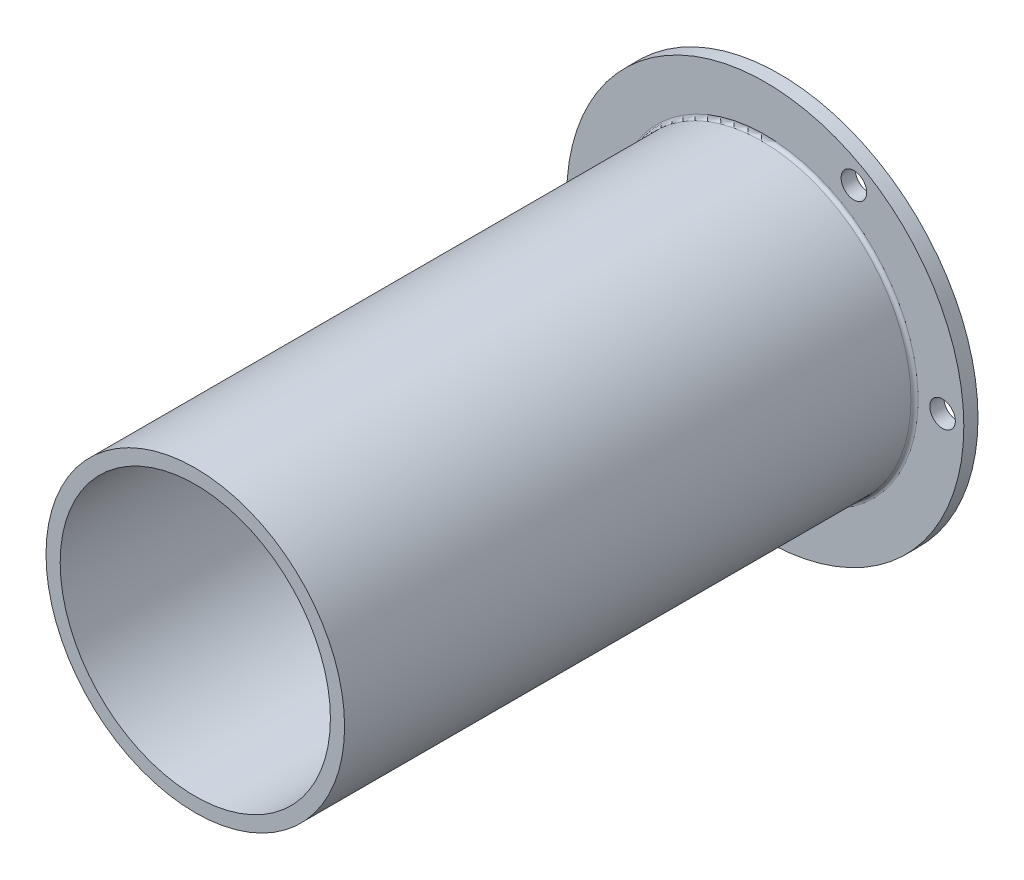
ISO-10303-21;
HEADER;
FILE_DESCRIPTION(('STEP AP214'),'2;1');
FILE_NAME('part.step','',(''),(''),'','','');
FILE_SCHEMA(('AUTOMOTIVE_DESIGN { 1 0 10303 214 1 1 1 1 }'));
ENDSEC;
DATA;
#1=APPLICATION_CONTEXT('core data for automotive mechanical design processes');
#2=APPLICATION_PROTOCOL_DEFINITION('international standard','automotive_design',2000,#1);
#3=PRODUCT_CONTEXT('',#1,'mechanical');
#4=PRODUCT('Part','Part','',(#3));
#5=PRODUCT_RELATED_PRODUCT_CATEGORY('part','',(#4));
#6=PRODUCT_DEFINITION_FORMATION('','',#4);
#7=PRODUCT_DEFINITION_CONTEXT('part definition',#1,'design');
#8=PRODUCT_DEFINITION('design','',#6,#7);
#9=PRODUCT_DEFINITION_SHAPE('','',#8);
#10=(LENGTH_UNIT() NAMED_UNIT(*) SI_UNIT(.MILLI.,.METRE.));
#11=(NAMED_UNIT(*) PLANE_ANGLE_UNIT() SI_UNIT($,.RADIAN.));
#12=(NAMED_UNIT(*) SI_UNIT($,.STERADIAN.) SOLID_ANGLE_UNIT());
#13=UNCERTAINTY_MEASURE_WITH_UNIT(LENGTH_MEASURE(1.E-05),#10,'distance_accuracy_value','');
#14=(GEOMETRIC_REPRESENTATION_CONTEXT(3) GLOBAL_UNCERTAINTY_ASSIGNED_CONTEXT((#13)) GLOBAL_UNIT_ASSIGNED_CONTEXT((#10,
#11,#12)) REPRESENTATION_CONTEXT('',''));
#15=CARTESIAN_POINT('',(0.,0.,0.));
#16=DIRECTION('',(0.,0.,1.));
#17=DIRECTION('',(1.,0.,0.));
#18=AXIS2_PLACEMENT_3D('',#15,#16,#17);
#19=CARTESIAN_POINT('',(0.,0.,40.18));
#20=DIRECTION('',(0.,0.,1.));
#21=DIRECTION('',(1.,0.,0.));
#22=AXIS2_PLACEMENT_3D('',#19,#20,#21);
#23=PLANE('',#22);
#24=CARTESIAN_POINT('',(0.,0.,40.18));
#25=DIRECTION('',(0.,0.,1.));
#26=DIRECTION('',(1.,0.,0.));
#27=AXIS2_PLACEMENT_3D('',#24,#25,#26);
#28=CIRCLE('',#27,10.525);
#29=CARTESIAN_POINT('',(10.525,0.,40.18));
#30=VERTEX_POINT('',#29);
#31=EDGE_CURVE('E42',#30,#30,#28,.T.);
#32=ORIENTED_EDGE('',*,*,#31,.T.);
#33=EDGE_LOOP('',(#32));
#34=FACE_BOUND('',#33,.T.);
#35=CARTESIAN_POINT('',(0.,0.,40.18));
#36=DIRECTION('',(0.,0.,1.));
#37=DIRECTION('',(1.,0.,0.));
#38=AXIS2_PLACEMENT_3D('',#35,#36,#37);
#39=CIRCLE('',#38,9.525);
#40=CARTESIAN_POINT('',(9.525,0.,40.18));
#41=VERTEX_POINT('',#40);
#42=EDGE_CURVE('E46',#41,#41,#39,.T.);
#43=ORIENTED_EDGE('',*,*,#42,.F.);
#44=EDGE_LOOP('',(#43));
#45=FACE_BOUND('',#44,.T.);
#46=ADVANCED_FACE('F31',(#34,#45),#23,.T.);
#47=CARTESIAN_POINT('',(0.,0.,40.18));
#48=DIRECTION('',(0.,0.,-1.));
#49=DIRECTION('',(-1.,0.,0.));
#50=AXIS2_PLACEMENT_3D('',#47,#48,#49);
#51=CYLINDRICAL_SURFACE('',#50,10.525);
#52=CARTESIAN_POINT('',(0.,0.,0.25));
#53=DIRECTION('',(0.,0.,-1.));
#54=DIRECTION('',(-1.,0.,0.));
#55=AXIS2_PLACEMENT_3D('',#52,#53,#54);
#56=CIRCLE('',#55,10.525);
#57=CARTESIAN_POINT('',(-10.525,0.,0.25));
#58=VERTEX_POINT('',#57);
#59=EDGE_CURVE('E38',#58,#58,#56,.F.);
#60=ORIENTED_EDGE('',*,*,#59,.T.);
#61=EDGE_LOOP('',(#60));
#62=FACE_BOUND('',#61,.T.);
#63=ORIENTED_EDGE('',*,*,#31,.F.);
#64=EDGE_LOOP('',(#63));
#65=FACE_BOUND('',#64,.T.);
#66=ADVANCED_FACE('F105',(#62,#65),#51,.T.);
#67=CARTESIAN_POINT('',(0.,0.,40.18));
#68=DIRECTION('',(0.,0.,-1.));
#69=DIRECTION('',(-1.,0.,0.));
#70=AXIS2_PLACEMENT_3D('',#67,#68,#69);
#71=CYLINDRICAL_SURFACE('',#70,9.525);
#72=ORIENTED_EDGE('',*,*,#42,.T.);
#73=EDGE_LOOP('',(#72));
#74=FACE_BOUND('',#73,.T.);
#75=CARTESIAN_POINT('',(0.,0.,-1.));
#76=DIRECTION('',(0.,0.,-1.));
#77=DIRECTION('',(-1.,0.,0.));
#78=AXIS2_PLACEMENT_3D('',#75,#76,#77);
#79=CIRCLE('',#78,9.525);
#80=CARTESIAN_POINT('',(-9.525,0.,-1.));
#81=VERTEX_POINT('',#80);
#82=EDGE_CURVE('E55',#81,#81,#79,.T.);
#83=ORIENTED_EDGE('',*,*,#82,.T.);
#84=EDGE_LOOP('',(#83));
#85=FACE_BOUND('',#84,.T.);
#86=ADVANCED_FACE('F92',(#74,#85),#71,.F.);
#87=CARTESIAN_POINT('',(0.,0.,-1.));
#88=DIRECTION('',(0.,0.,-1.));
#89=DIRECTION('',(-1.,0.,0.));
#90=AXIS2_PLACEMENT_3D('',#87,#88,#89);
#91=PLANE('',#90);
#92=CARTESIAN_POINT('',(6.25000000000005,10.8253175473055,-1.));
#93=DIRECTION('',(0.,0.,-1.));
#94=DIRECTION('',(0.500000000000004,0.866025403784436,0.));
#95=AXIS2_PLACEMENT_3D('',#92,#93,#94);
#96=CIRCLE('',#95,0.899999999999999);
#97=CARTESIAN_POINT('',(6.70000000000006,11.6047404107115,-1.));
#98=VERTEX_POINT('',#97);
#99=EDGE_CURVE('E77',#98,#98,#96,.T.);
#100=ORIENTED_EDGE('',*,*,#99,.F.);
#101=EDGE_LOOP('',(#100));
#102=FACE_BOUND('',#101,.T.);
#103=CARTESIAN_POINT('',(12.5,0.,-1.));
#104=DIRECTION('',(0.,0.,-1.));
#105=DIRECTION('',(1.,0.,0.));
#106=AXIS2_PLACEMENT_3D('',#103,#104,#105);
#107=CIRCLE('',#106,0.899999999999999);
#108=CARTESIAN_POINT('',(13.4,0.,-1.));
#109=VERTEX_POINT('',#108);
#110=EDGE_CURVE('E70',#109,#109,#107,.T.);
#111=ORIENTED_EDGE('',*,*,#110,.F.);
#112=EDGE_LOOP('',(#111));
#113=FACE_BOUND('',#112,.T.);
#114=CARTESIAN_POINT('',(-6.25000000000013,-10.8253175473054,-1.));
#115=DIRECTION('',(0.,0.,-1.));
#116=DIRECTION('',(-0.50000000000001,-0.866025403784433,0.));
#117=AXIS2_PLACEMENT_3D('',#114,#115,#116);
#118=CIRCLE('',#117,0.899999999999999);
#119=CARTESIAN_POINT('',(-6.70000000000014,-11.6047404107114,-1.));
#120=VERTEX_POINT('',#119);
#121=EDGE_CURVE('E71',#120,#120,#118,.T.);
#122=ORIENTED_EDGE('',*,*,#121,.F.);
#123=EDGE_LOOP('',(#122));
#124=FACE_BOUND('',#123,.T.);
#125=CARTESIAN_POINT('',(-12.5,0.,-1.));
#126=DIRECTION('',(0.,0.,-1.));
#127=DIRECTION('',(-1.,0.,0.));
#128=AXIS2_PLACEMENT_3D('',#125,#126,#127);
#129=CIRCLE('',#128,0.899999999999999);
#130=CARTESIAN_POINT('',(-13.4,0.,-1.));
#131=VERTEX_POINT('',#130);
#132=EDGE_CURVE('E60',#131,#131,#129,.T.);
#133=ORIENTED_EDGE('',*,*,#132,.F.);
#134=EDGE_LOOP('',(#133));
#135=FACE_BOUND('',#134,.T.);
#136=CARTESIAN_POINT('',(0.,0.,-1.));
#137=DIRECTION('',(0.,0.,-1.));
#138=DIRECTION('',(-1.,0.,0.));
#139=AXIS2_PLACEMENT_3D('',#136,#137,#138);
#140=CIRCLE('',#139,14.);
#141=CARTESIAN_POINT('',(-14.,0.,-1.));
#142=VERTEX_POINT('',#141);
#143=EDGE_CURVE('E51',#142,#142,#140,.T.);
#144=ORIENTED_EDGE('',*,*,#143,.T.);
#145=EDGE_LOOP('',(#144));
#146=FACE_BOUND('',#145,.T.);
#147=ORIENTED_EDGE('',*,*,#82,.F.);
#148=EDGE_LOOP('',(#147));
#149=FACE_BOUND('',#148,.T.);
#150=ADVANCED_FACE('F88',(#102,#113,#124,#135,#146,#149),#91,.T.);
#151=CARTESIAN_POINT('',(0.,0.,0.));
#152=DIRECTION('',(0.,0.,-1.));
#153=DIRECTION('',(-1.,0.,0.));
#154=AXIS2_PLACEMENT_3D('',#151,#152,#153);
#155=PLANE('',#154);
#156=CARTESIAN_POINT('',(0.,0.,0.));
#157=DIRECTION('',(0.,0.,-1.));
#158=DIRECTION('',(-1.,0.,0.));
#159=AXIS2_PLACEMENT_3D('',#156,#157,#158);
#160=CIRCLE('',#159,10.775);
#161=CARTESIAN_POINT('',(-10.775,0.,0.));
#162=VERTEX_POINT('',#161);
#163=EDGE_CURVE('E10',#162,#162,#160,.T.);
#164=ORIENTED_EDGE('',*,*,#163,.T.);
#165=EDGE_LOOP('',(#164));
#166=FACE_BOUND('',#165,.T.);
#167=CARTESIAN_POINT('',(6.25000000000005,10.8253175473055,0.));
#168=DIRECTION('',(0.,0.,1.));
#169=DIRECTION('',(-0.500000000000004,-0.866025403784436,0.));
#170=AXIS2_PLACEMENT_3D('',#167,#168,#169);
#171=CIRCLE('',#170,0.9);
#172=CARTESIAN_POINT('',(5.80000000000005,10.0458946838995,0.));
#173=VERTEX_POINT('',#172);
#174=EDGE_CURVE('E66',#173,#173,#171,.T.);
#175=ORIENTED_EDGE('',*,*,#174,.F.);
#176=EDGE_LOOP('',(#175));
#177=FACE_BOUND('',#176,.T.);
#178=CARTESIAN_POINT('',(12.5,0.,0.));
#179=DIRECTION('',(0.,0.,1.));
#180=DIRECTION('',(-1.,0.,0.));
#181=AXIS2_PLACEMENT_3D('',#178,#179,#180);
#182=CIRCLE('',#181,0.9);
#183=CARTESIAN_POINT('',(11.6,0.,0.));
#184=VERTEX_POINT('',#183);
#185=EDGE_CURVE('E74',#184,#184,#182,.T.);
#186=ORIENTED_EDGE('',*,*,#185,.F.);
#187=EDGE_LOOP('',(#186));
#188=FACE_BOUND('',#187,.T.);
#189=CARTESIAN_POINT('',(-6.25000000000013,-10.8253175473054,0.));
#190=DIRECTION('',(0.,0.,1.));
#191=DIRECTION('',(0.50000000000001,0.866025403784433,0.));
#192=AXIS2_PLACEMENT_3D('',#189,#190,#191);
#193=CIRCLE('',#192,0.9);
#194=CARTESIAN_POINT('',(-5.80000000000012,-10.0458946838994,0.));
#195=VERTEX_POINT('',#194);
#196=EDGE_CURVE('E67',#195,#195,#193,.T.);
#197=ORIENTED_EDGE('',*,*,#196,.F.);
#198=EDGE_LOOP('',(#197));
#199=FACE_BOUND('',#198,.T.);
#200=CARTESIAN_POINT('',(-12.5,0.,0.));
#201=DIRECTION('',(0.,0.,1.));
#202=DIRECTION('',(1.,0.,0.));
#203=AXIS2_PLACEMENT_3D('',#200,#201,#202);
#204=CIRCLE('',#203,0.9);
#205=CARTESIAN_POINT('',(-11.6,0.,0.));
#206=VERTEX_POINT('',#205);
#207=EDGE_CURVE('E63',#206,#206,#204,.T.);
#208=ORIENTED_EDGE('',*,*,#207,.F.);
#209=EDGE_LOOP('',(#208));
#210=FACE_BOUND('',#209,.T.);
#211=CARTESIAN_POINT('',(0.,0.,0.));
#212=DIRECTION('',(0.,0.,-1.));
#213=DIRECTION('',(-1.,0.,0.));
#214=AXIS2_PLACEMENT_3D('',#211,#212,#213);
#215=CIRCLE('',#214,14.);
#216=CARTESIAN_POINT('',(-14.,0.,0.));
#217=VERTEX_POINT('',#216);
#218=EDGE_CURVE('E52',#217,#217,#215,.T.);
#219=ORIENTED_EDGE('',*,*,#218,.F.);
#220=EDGE_LOOP('',(#219));
#221=FACE_BOUND('',#220,.T.);
#222=ADVANCED_FACE('F91',(#166,#177,#188,#199,#210,#221),#155,.F.);
#223=CARTESIAN_POINT('',(0.,0.,-1.));
#224=DIRECTION('',(0.,0.,1.));
#225=DIRECTION('',(1.,0.,0.));
#226=AXIS2_PLACEMENT_3D('',#223,#224,#225);
#227=CYLINDRICAL_SURFACE('',#226,14.);
#228=ORIENTED_EDGE('',*,*,#143,.F.);
#229=EDGE_LOOP('',(#228));
#230=FACE_BOUND('',#229,.T.);
#231=ORIENTED_EDGE('',*,*,#218,.T.);
#232=EDGE_LOOP('',(#231));
#233=FACE_BOUND('',#232,.T.);
#234=ADVANCED_FACE('F140',(#230,#233),#227,.T.);
#235=CARTESIAN_POINT('',(-12.5,0.,0.));
#236=DIRECTION('',(0.,0.,1.));
#237=DIRECTION('',(1.,0.,0.));
#238=AXIS2_PLACEMENT_3D('',#235,#236,#237);
#239=CYLINDRICAL_SURFACE('',#238,0.899999999999999);
#240=ORIENTED_EDGE('',*,*,#132,.T.);
#241=EDGE_LOOP('',(#240));
#242=FACE_BOUND('',#241,.T.);
#243=ORIENTED_EDGE('',*,*,#207,.T.);
#244=EDGE_LOOP('',(#243));
#245=FACE_BOUND('',#244,.T.);
#246=ADVANCED_FACE('F169',(#242,#245),#239,.F.);
#247=CARTESIAN_POINT('',(-6.25000000000013,-10.8253175473054,0.));
#248=DIRECTION('',(0.,0.,1.));
#249=DIRECTION('',(0.50000000000001,0.866025403784433,0.));
#250=AXIS2_PLACEMENT_3D('',#247,#248,#249);
#251=CYLINDRICAL_SURFACE('',#250,0.899999999999999);
#252=ORIENTED_EDGE('',*,*,#121,.T.);
#253=EDGE_LOOP('',(#252));
#254=FACE_BOUND('',#253,.T.);
#255=ORIENTED_EDGE('',*,*,#196,.T.);
#256=EDGE_LOOP('',(#255));
#257=FACE_BOUND('',#256,.T.);
#258=ADVANCED_FACE('F161',(#254,#257),#251,.F.);
#259=CARTESIAN_POINT('',(12.5,0.,0.));
#260=DIRECTION('',(0.,0.,1.));
#261=DIRECTION('',(-1.,0.,0.));
#262=AXIS2_PLACEMENT_3D('',#259,#260,#261);
#263=CYLINDRICAL_SURFACE('',#262,0.899999999999999);
#264=ORIENTED_EDGE('',*,*,#110,.T.);
#265=EDGE_LOOP('',(#264));
#266=FACE_BOUND('',#265,.T.);
#267=ORIENTED_EDGE('',*,*,#185,.T.);
#268=EDGE_LOOP('',(#267));
#269=FACE_BOUND('',#268,.T.);
#270=ADVANCED_FACE('F157',(#266,#269),#263,.F.);
#271=CARTESIAN_POINT('',(6.25000000000005,10.8253175473055,0.));
#272=DIRECTION('',(0.,0.,1.));
#273=DIRECTION('',(-0.500000000000004,-0.866025403784436,0.));
#274=AXIS2_PLACEMENT_3D('',#271,#272,#273);
#275=CYLINDRICAL_SURFACE('',#274,0.899999999999999);
#276=ORIENTED_EDGE('',*,*,#99,.T.);
#277=EDGE_LOOP('',(#276));
#278=FACE_BOUND('',#277,.T.);
#279=ORIENTED_EDGE('',*,*,#174,.T.);
#280=EDGE_LOOP('',(#279));
#281=FACE_BOUND('',#280,.T.);
#282=ADVANCED_FACE('F85',(#278,#281),#275,.F.);
#283=CARTESIAN_POINT('',(0.,0.,0.25));
#284=DIRECTION('',(0.,0.,-1.));
#285=DIRECTION('',(-1.,0.,0.));
#286=AXIS2_PLACEMENT_3D('',#283,#284,#285);
#287=TOROIDAL_SURFACE('',#286,10.775,0.25);
#288=ORIENTED_EDGE('',*,*,#163,.F.);
#289=EDGE_LOOP('',(#288));
#290=FACE_BOUND('',#289,.T.);
#291=ORIENTED_EDGE('',*,*,#59,.F.);
#292=EDGE_LOOP('',(#291));
#293=FACE_BOUND('',#292,.T.);
#294=ADVANCED_FACE('F33',(#290,#293),#287,.F.);
#295=CLOSED_SHELL('',(#46,#66,#86,#150,#222,#234,#246,#258,#270,#282,#294));
#296=MANIFOLD_SOLID_BREP('B2',#295);
#297=ADVANCED_BREP_SHAPE_REPRESENTATION('',(#18,#296),#14);
#298=SHAPE_DEFINITION_REPRESENTATION(#9,#297);
ENDSEC;
END-ISO-10303-21;
